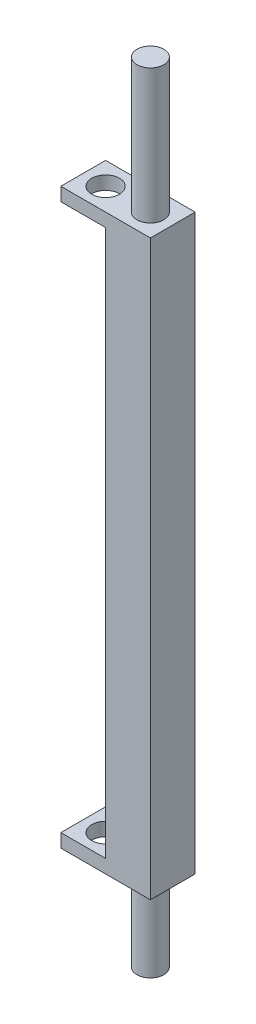
ISO-10303-21;
HEADER;
FILE_DESCRIPTION(('STEP AP214'),'2;1');
FILE_NAME('part.step','',(''),(''),'','','');
FILE_SCHEMA(('AUTOMOTIVE_DESIGN { 1 0 10303 214 1 1 1 1 }'));
ENDSEC;
DATA;
#1=APPLICATION_CONTEXT('core data for automotive mechanical design processes');
#2=APPLICATION_PROTOCOL_DEFINITION('international standard','automotive_design',2000,#1);
#3=PRODUCT_CONTEXT('',#1,'mechanical');
#4=PRODUCT('Part','Part','',(#3));
#5=PRODUCT_RELATED_PRODUCT_CATEGORY('part','',(#4));
#6=PRODUCT_DEFINITION_FORMATION('','',#4);
#7=PRODUCT_DEFINITION_CONTEXT('part definition',#1,'design');
#8=PRODUCT_DEFINITION('design','',#6,#7);
#9=PRODUCT_DEFINITION_SHAPE('','',#8);
#10=(LENGTH_UNIT() NAMED_UNIT(*) SI_UNIT(.MILLI.,.METRE.));
#11=(NAMED_UNIT(*) PLANE_ANGLE_UNIT() SI_UNIT($,.RADIAN.));
#12=(NAMED_UNIT(*) SI_UNIT($,.STERADIAN.) SOLID_ANGLE_UNIT());
#13=UNCERTAINTY_MEASURE_WITH_UNIT(LENGTH_MEASURE(1.E-05),#10,'distance_accuracy_value','');
#14=(GEOMETRIC_REPRESENTATION_CONTEXT(3) GLOBAL_UNCERTAINTY_ASSIGNED_CONTEXT((#13)) GLOBAL_UNIT_ASSIGNED_CONTEXT((#10,
#11,#12)) REPRESENTATION_CONTEXT('',''));
#15=CARTESIAN_POINT('',(0.,0.,0.));
#16=DIRECTION('',(0.,0.,1.));
#17=DIRECTION('',(1.,0.,0.));
#18=AXIS2_PLACEMENT_3D('',#15,#16,#17);
#19=CARTESIAN_POINT('',(0.,0.,0.));
#20=DIRECTION('',(0.,1.,0.));
#21=DIRECTION('',(0.,0.,1.));
#22=AXIS2_PLACEMENT_3D('',#19,#20,#21);
#23=PLANE('',#22);
#24=CARTESIAN_POINT('',(-2.5,0.,0.));
#25=DIRECTION('',(0.,-1.,0.));
#26=DIRECTION('',(0.,0.,-1.));
#27=AXIS2_PLACEMENT_3D('',#24,#25,#26);
#28=CIRCLE('',#27,1.55);
#29=CARTESIAN_POINT('',(-2.5,0.,-1.55));
#30=VERTEX_POINT('',#29);
#31=EDGE_CURVE('E157',#30,#30,#28,.T.);
#32=ORIENTED_EDGE('',*,*,#31,.F.);
#33=EDGE_LOOP('',(#32));
#34=FACE_BOUND('',#33,.T.);
#35=DIRECTION('',(0.,0.,-1.));
#36=VECTOR('',#35,1.);
#37=CARTESIAN_POINT('',(0.,0.,2.5));
#38=LINE('',#37,#36);
#39=CARTESIAN_POINT('',(0.,0.,2.5));
#40=VERTEX_POINT('',#39);
#41=CARTESIAN_POINT('',(0.,0.,-2.5));
#42=VERTEX_POINT('',#41);
#43=EDGE_CURVE('E50',#40,#42,#38,.T.);
#44=ORIENTED_EDGE('',*,*,#43,.F.);
#45=DIRECTION('',(-1.,0.,0.));
#46=VECTOR('',#45,1.);
#47=CARTESIAN_POINT('',(5.,0.,2.5));
#48=LINE('',#47,#46);
#49=CARTESIAN_POINT('',(-5.,0.,2.5));
#50=VERTEX_POINT('',#49);
#51=EDGE_CURVE('E72',#40,#50,#48,.T.);
#52=ORIENTED_EDGE('',*,*,#51,.T.);
#53=DIRECTION('',(0.,0.,-1.));
#54=VECTOR('',#53,1.);
#55=CARTESIAN_POINT('',(-5.,0.,2.5));
#56=LINE('',#55,#54);
#57=CARTESIAN_POINT('',(-5.,0.,-2.5));
#58=VERTEX_POINT('',#57);
#59=EDGE_CURVE('E171',#50,#58,#56,.T.);
#60=ORIENTED_EDGE('',*,*,#59,.T.);
#61=DIRECTION('',(-1.,0.,0.));
#62=VECTOR('',#61,1.);
#63=CARTESIAN_POINT('',(5.,0.,-2.5));
#64=LINE('',#63,#62);
#65=EDGE_CURVE('E161',#42,#58,#64,.T.);
#66=ORIENTED_EDGE('',*,*,#65,.F.);
#67=EDGE_LOOP('',(#44,#52,#60,#66));
#68=FACE_BOUND('',#67,.T.);
#69=ADVANCED_FACE('F35',(#34,#68),#23,.F.);
#70=CARTESIAN_POINT('',(5.,1.5,2.5));
#71=DIRECTION('',(-1.,0.,0.));
#72=DIRECTION('',(0.,0.,1.));
#73=AXIS2_PLACEMENT_3D('',#70,#71,#72);
#74=PLANE('',#73);
#75=DIRECTION('',(0.,-1.,0.));
#76=VECTOR('',#75,1.);
#77=CARTESIAN_POINT('',(5.,1.5,2.5));
#78=LINE('',#77,#76);
#79=CARTESIAN_POINT('',(5.,1.5,2.5));
#80=VERTEX_POINT('',#79);
#81=CARTESIAN_POINT('',(5.,-62.5,2.5));
#82=VERTEX_POINT('',#81);
#83=EDGE_CURVE('E59',#80,#82,#78,.T.);
#84=ORIENTED_EDGE('',*,*,#83,.T.);
#85=DIRECTION('',(0.,0.,1.));
#86=VECTOR('',#85,1.);
#87=CARTESIAN_POINT('',(5.,-62.5,2.5));
#88=LINE('',#87,#86);
#89=CARTESIAN_POINT('',(5.,-62.5,-2.5));
#90=VERTEX_POINT('',#89);
#91=EDGE_CURVE('E109',#90,#82,#88,.T.);
#92=ORIENTED_EDGE('',*,*,#91,.F.);
#93=DIRECTION('',(0.,-1.,0.));
#94=VECTOR('',#93,1.);
#95=CARTESIAN_POINT('',(5.,1.5,-2.5));
#96=LINE('',#95,#94);
#97=CARTESIAN_POINT('',(5.,1.5,-2.5));
#98=VERTEX_POINT('',#97);
#99=EDGE_CURVE('E43',#98,#90,#96,.T.);
#100=ORIENTED_EDGE('',*,*,#99,.F.);
#101=DIRECTION('',(0.,0.,-1.));
#102=VECTOR('',#101,1.);
#103=CARTESIAN_POINT('',(5.,1.5,2.5));
#104=LINE('',#103,#102);
#105=EDGE_CURVE('E110',#80,#98,#104,.T.);
#106=ORIENTED_EDGE('',*,*,#105,.F.);
#107=EDGE_LOOP('',(#84,#92,#100,#106));
#108=FACE_BOUND('',#107,.T.);
#109=ADVANCED_FACE('F37',(#108),#74,.F.);
#110=CARTESIAN_POINT('',(5.,1.5,-2.5));
#111=DIRECTION('',(0.,0.,1.));
#112=DIRECTION('',(1.,0.,0.));
#113=AXIS2_PLACEMENT_3D('',#110,#111,#112);
#114=PLANE('',#113);
#115=ORIENTED_EDGE('',*,*,#99,.T.);
#116=DIRECTION('',(1.,0.,0.));
#117=VECTOR('',#116,1.);
#118=CARTESIAN_POINT('',(5.,-62.5,-2.5));
#119=LINE('',#118,#117);
#120=CARTESIAN_POINT('',(-5.,-62.5,-2.5));
#121=VERTEX_POINT('',#120);
#122=EDGE_CURVE('E127',#121,#90,#119,.T.);
#123=ORIENTED_EDGE('',*,*,#122,.F.);
#124=DIRECTION('',(0.,1.,0.));
#125=VECTOR('',#124,1.);
#126=CARTESIAN_POINT('',(-5.,-62.5,-2.5));
#127=LINE('',#126,#125);
#128=CARTESIAN_POINT('',(-5.,-61.,-2.5));
#129=VERTEX_POINT('',#128);
#130=EDGE_CURVE('E139',#121,#129,#127,.T.);
#131=ORIENTED_EDGE('',*,*,#130,.T.);
#132=DIRECTION('',(1.,0.,0.));
#133=VECTOR('',#132,1.);
#134=CARTESIAN_POINT('',(5.,-61.,-2.5));
#135=LINE('',#134,#133);
#136=CARTESIAN_POINT('',(0.,-61.,-2.5));
#137=VERTEX_POINT('',#136);
#138=EDGE_CURVE('E128',#129,#137,#135,.T.);
#139=ORIENTED_EDGE('',*,*,#138,.T.);
#140=DIRECTION('',(0.,1.,0.));
#141=VECTOR('',#140,1.);
#142=CARTESIAN_POINT('',(0.,-61.,-2.5));
#143=LINE('',#142,#141);
#144=EDGE_CURVE('E150',#137,#42,#143,.T.);
#145=ORIENTED_EDGE('',*,*,#144,.T.);
#146=ORIENTED_EDGE('',*,*,#65,.T.);
#147=DIRECTION('',(0.,-1.,0.));
#148=VECTOR('',#147,1.);
#149=CARTESIAN_POINT('',(-5.,1.5,-2.5));
#150=LINE('',#149,#148);
#151=CARTESIAN_POINT('',(-5.,1.5,-2.5));
#152=VERTEX_POINT('',#151);
#153=EDGE_CURVE('E175',#152,#58,#150,.T.);
#154=ORIENTED_EDGE('',*,*,#153,.F.);
#155=DIRECTION('',(-1.,0.,0.));
#156=VECTOR('',#155,1.);
#157=CARTESIAN_POINT('',(5.,1.5,-2.5));
#158=LINE('',#157,#156);
#159=EDGE_CURVE('E80',#98,#152,#158,.T.);
#160=ORIENTED_EDGE('',*,*,#159,.F.);
#161=EDGE_LOOP('',(#115,#123,#131,#139,#145,#146,#154,#160));
#162=FACE_BOUND('',#161,.T.);
#163=ADVANCED_FACE('F177',(#162),#114,.F.);
#164=CARTESIAN_POINT('',(-5.,1.5,2.5));
#165=DIRECTION('',(-1.,0.,0.));
#166=DIRECTION('',(0.,0.,1.));
#167=AXIS2_PLACEMENT_3D('',#164,#165,#166);
#168=PLANE('',#167);
#169=ORIENTED_EDGE('',*,*,#59,.F.);
#170=DIRECTION('',(0.,-1.,0.));
#171=VECTOR('',#170,1.);
#172=CARTESIAN_POINT('',(-5.,1.5,2.5));
#173=LINE('',#172,#171);
#174=CARTESIAN_POINT('',(-5.,1.5,2.5));
#175=VERTEX_POINT('',#174);
#176=EDGE_CURVE('E112',#175,#50,#173,.T.);
#177=ORIENTED_EDGE('',*,*,#176,.F.);
#178=DIRECTION('',(0.,0.,-1.));
#179=VECTOR('',#178,1.);
#180=CARTESIAN_POINT('',(-5.,1.5,2.5));
#181=LINE('',#180,#179);
#182=EDGE_CURVE('E166',#175,#152,#181,.T.);
#183=ORIENTED_EDGE('',*,*,#182,.T.);
#184=ORIENTED_EDGE('',*,*,#153,.T.);
#185=EDGE_LOOP('',(#169,#177,#183,#184));
#186=FACE_BOUND('',#185,.T.);
#187=ADVANCED_FACE('F191',(#186),#168,.T.);
#188=CARTESIAN_POINT('',(5.,1.5,2.5));
#189=DIRECTION('',(0.,0.,1.));
#190=DIRECTION('',(1.,0.,0.));
#191=AXIS2_PLACEMENT_3D('',#188,#189,#190);
#192=PLANE('',#191);
#193=ORIENTED_EDGE('',*,*,#51,.F.);
#194=DIRECTION('',(0.,1.,0.));
#195=VECTOR('',#194,1.);
#196=CARTESIAN_POINT('',(0.,-61.,2.5));
#197=LINE('',#196,#195);
#198=CARTESIAN_POINT('',(0.,-61.,2.5));
#199=VERTEX_POINT('',#198);
#200=EDGE_CURVE('E154',#199,#40,#197,.T.);
#201=ORIENTED_EDGE('',*,*,#200,.F.);
#202=DIRECTION('',(-1.,0.,0.));
#203=VECTOR('',#202,1.);
#204=CARTESIAN_POINT('',(5.,-61.,2.5));
#205=LINE('',#204,#203);
#206=CARTESIAN_POINT('',(-5.,-61.,2.5));
#207=VERTEX_POINT('',#206);
#208=EDGE_CURVE('E140',#199,#207,#205,.T.);
#209=ORIENTED_EDGE('',*,*,#208,.T.);
#210=DIRECTION('',(0.,1.,0.));
#211=VECTOR('',#210,1.);
#212=CARTESIAN_POINT('',(-5.,-62.5,2.5));
#213=LINE('',#212,#211);
#214=CARTESIAN_POINT('',(-5.,-62.5,2.5));
#215=VERTEX_POINT('',#214);
#216=EDGE_CURVE('E119',#215,#207,#213,.T.);
#217=ORIENTED_EDGE('',*,*,#216,.F.);
#218=DIRECTION('',(-1.,0.,0.));
#219=VECTOR('',#218,1.);
#220=CARTESIAN_POINT('',(5.,-62.5,2.5));
#221=LINE('',#220,#219);
#222=EDGE_CURVE('E116',#82,#215,#221,.T.);
#223=ORIENTED_EDGE('',*,*,#222,.F.);
#224=ORIENTED_EDGE('',*,*,#83,.F.);
#225=DIRECTION('',(-1.,0.,0.));
#226=VECTOR('',#225,1.);
#227=CARTESIAN_POINT('',(5.,1.5,2.5));
#228=LINE('',#227,#226);
#229=EDGE_CURVE('E113',#80,#175,#228,.T.);
#230=ORIENTED_EDGE('',*,*,#229,.T.);
#231=ORIENTED_EDGE('',*,*,#176,.T.);
#232=EDGE_LOOP('',(#193,#201,#209,#217,#223,#224,#230,#231));
#233=FACE_BOUND('',#232,.T.);
#234=ADVANCED_FACE('F117',(#233),#192,.T.);
#235=CARTESIAN_POINT('',(0.,1.5,0.));
#236=DIRECTION('',(0.,1.,0.));
#237=DIRECTION('',(0.,0.,1.));
#238=AXIS2_PLACEMENT_3D('',#235,#236,#237);
#239=PLANE('',#238);
#240=CARTESIAN_POINT('',(2.5,1.5,0.));
#241=DIRECTION('',(0.,1.,0.));
#242=DIRECTION('',(0.,0.,1.));
#243=AXIS2_PLACEMENT_3D('',#240,#241,#242);
#244=CIRCLE('',#243,1.5);
#245=CARTESIAN_POINT('',(2.5,1.5,1.5));
#246=VERTEX_POINT('',#245);
#247=EDGE_CURVE('E330',#246,#246,#244,.T.);
#248=ORIENTED_EDGE('',*,*,#247,.F.);
#249=EDGE_LOOP('',(#248));
#250=FACE_BOUND('',#249,.T.);
#251=CARTESIAN_POINT('',(-2.5,1.5,0.));
#252=DIRECTION('',(0.,-1.,0.));
#253=DIRECTION('',(0.,0.,-1.));
#254=AXIS2_PLACEMENT_3D('',#251,#252,#253);
#255=CIRCLE('',#254,1.55);
#256=CARTESIAN_POINT('',(-2.5,1.5,-1.55));
#257=VERTEX_POINT('',#256);
#258=EDGE_CURVE('E158',#257,#257,#255,.T.);
#259=ORIENTED_EDGE('',*,*,#258,.T.);
#260=EDGE_LOOP('',(#259));
#261=FACE_BOUND('',#260,.T.);
#262=ORIENTED_EDGE('',*,*,#105,.T.);
#263=ORIENTED_EDGE('',*,*,#159,.T.);
#264=ORIENTED_EDGE('',*,*,#182,.F.);
#265=ORIENTED_EDGE('',*,*,#229,.F.);
#266=EDGE_LOOP('',(#262,#263,#264,#265));
#267=FACE_BOUND('',#266,.T.);
#268=ADVANCED_FACE('F193',(#250,#261,#267),#239,.T.);
#269=CARTESIAN_POINT('',(-2.5,1.5,0.));
#270=DIRECTION('',(0.,-1.,0.));
#271=DIRECTION('',(0.,0.,-1.));
#272=AXIS2_PLACEMENT_3D('',#269,#270,#271);
#273=CYLINDRICAL_SURFACE('',#272,1.55);
#274=ORIENTED_EDGE('',*,*,#258,.F.);
#275=EDGE_LOOP('',(#274));
#276=FACE_BOUND('',#275,.T.);
#277=ORIENTED_EDGE('',*,*,#31,.T.);
#278=EDGE_LOOP('',(#277));
#279=FACE_BOUND('',#278,.T.);
#280=ADVANCED_FACE('F195',(#276,#279),#273,.F.);
#281=CARTESIAN_POINT('',(0.,-61.,2.5));
#282=DIRECTION('',(1.,0.,0.));
#283=DIRECTION('',(0.,0.,-1.));
#284=AXIS2_PLACEMENT_3D('',#281,#282,#283);
#285=PLANE('',#284);
#286=ORIENTED_EDGE('',*,*,#43,.T.);
#287=ORIENTED_EDGE('',*,*,#144,.F.);
#288=DIRECTION('',(0.,0.,-1.));
#289=VECTOR('',#288,1.);
#290=CARTESIAN_POINT('',(0.,-61.,2.5));
#291=LINE('',#290,#289);
#292=EDGE_CURVE('E147',#199,#137,#291,.T.);
#293=ORIENTED_EDGE('',*,*,#292,.F.);
#294=ORIENTED_EDGE('',*,*,#200,.T.);
#295=EDGE_LOOP('',(#286,#287,#293,#294));
#296=FACE_BOUND('',#295,.T.);
#297=ADVANCED_FACE('F187',(#296),#285,.F.);
#298=CARTESIAN_POINT('',(-5.,-62.5,2.5));
#299=DIRECTION('',(1.,0.,0.));
#300=DIRECTION('',(0.,0.,-1.));
#301=AXIS2_PLACEMENT_3D('',#298,#299,#300);
#302=PLANE('',#301);
#303=DIRECTION('',(0.,0.,-1.));
#304=VECTOR('',#303,1.);
#305=CARTESIAN_POINT('',(-5.,-61.,2.5));
#306=LINE('',#305,#304);
#307=EDGE_CURVE('E131',#207,#129,#306,.T.);
#308=ORIENTED_EDGE('',*,*,#307,.T.);
#309=ORIENTED_EDGE('',*,*,#130,.F.);
#310=DIRECTION('',(0.,0.,-1.));
#311=VECTOR('',#310,1.);
#312=CARTESIAN_POINT('',(-5.,-62.5,2.5));
#313=LINE('',#312,#311);
#314=EDGE_CURVE('E122',#215,#121,#313,.T.);
#315=ORIENTED_EDGE('',*,*,#314,.F.);
#316=ORIENTED_EDGE('',*,*,#216,.T.);
#317=EDGE_LOOP('',(#308,#309,#315,#316));
#318=FACE_BOUND('',#317,.T.);
#319=ADVANCED_FACE('F241',(#318),#302,.F.);
#320=CARTESIAN_POINT('',(0.,-62.5,0.));
#321=DIRECTION('',(0.,1.,0.));
#322=DIRECTION('',(0.,0.,1.));
#323=AXIS2_PLACEMENT_3D('',#320,#321,#322);
#324=PLANE('',#323);
#325=CARTESIAN_POINT('',(2.5,-62.5,0.));
#326=DIRECTION('',(0.,1.,0.));
#327=DIRECTION('',(0.,0.,1.));
#328=AXIS2_PLACEMENT_3D('',#325,#326,#327);
#329=CIRCLE('',#328,1.5);
#330=CARTESIAN_POINT('',(2.5,-62.5,1.5));
#331=VERTEX_POINT('',#330);
#332=EDGE_CURVE('E11',#331,#331,#329,.F.);
#333=ORIENTED_EDGE('',*,*,#332,.F.);
#334=EDGE_LOOP('',(#333));
#335=FACE_BOUND('',#334,.T.);
#336=CARTESIAN_POINT('',(-2.5,-62.5,0.));
#337=DIRECTION('',(0.,-1.,0.));
#338=DIRECTION('',(0.,0.,-1.));
#339=AXIS2_PLACEMENT_3D('',#336,#337,#338);
#340=CIRCLE('',#339,1.55);
#341=CARTESIAN_POINT('',(-2.5,-62.5,-1.55));
#342=VERTEX_POINT('',#341);
#343=EDGE_CURVE('E134',#342,#342,#340,.T.);
#344=ORIENTED_EDGE('',*,*,#343,.F.);
#345=EDGE_LOOP('',(#344));
#346=FACE_BOUND('',#345,.T.);
#347=ORIENTED_EDGE('',*,*,#91,.T.);
#348=ORIENTED_EDGE('',*,*,#222,.T.);
#349=ORIENTED_EDGE('',*,*,#314,.T.);
#350=ORIENTED_EDGE('',*,*,#122,.T.);
#351=EDGE_LOOP('',(#347,#348,#349,#350));
#352=FACE_BOUND('',#351,.T.);
#353=ADVANCED_FACE('F125',(#335,#346,#352),#324,.F.);
#354=CARTESIAN_POINT('',(0.,-61.,0.));
#355=DIRECTION('',(0.,1.,0.));
#356=DIRECTION('',(0.,0.,1.));
#357=AXIS2_PLACEMENT_3D('',#354,#355,#356);
#358=PLANE('',#357);
#359=CARTESIAN_POINT('',(-2.5,-61.,0.));
#360=DIRECTION('',(0.,-1.,0.));
#361=DIRECTION('',(0.,0.,-1.));
#362=AXIS2_PLACEMENT_3D('',#359,#360,#361);
#363=CIRCLE('',#362,1.55);
#364=CARTESIAN_POINT('',(-2.5,-61.,-1.55));
#365=VERTEX_POINT('',#364);
#366=EDGE_CURVE('E142',#365,#365,#363,.T.);
#367=ORIENTED_EDGE('',*,*,#366,.T.);
#368=EDGE_LOOP('',(#367));
#369=FACE_BOUND('',#368,.T.);
#370=ORIENTED_EDGE('',*,*,#208,.F.);
#371=ORIENTED_EDGE('',*,*,#292,.T.);
#372=ORIENTED_EDGE('',*,*,#138,.F.);
#373=ORIENTED_EDGE('',*,*,#307,.F.);
#374=EDGE_LOOP('',(#370,#371,#372,#373));
#375=FACE_BOUND('',#374,.T.);
#376=ADVANCED_FACE('F184',(#369,#375),#358,.T.);
#377=CARTESIAN_POINT('',(-2.5,-61.,0.));
#378=DIRECTION('',(0.,-1.,0.));
#379=DIRECTION('',(0.,0.,-1.));
#380=AXIS2_PLACEMENT_3D('',#377,#378,#379);
#381=CYLINDRICAL_SURFACE('',#380,1.55);
#382=ORIENTED_EDGE('',*,*,#366,.F.);
#383=EDGE_LOOP('',(#382));
#384=FACE_BOUND('',#383,.T.);
#385=ORIENTED_EDGE('',*,*,#343,.T.);
#386=EDGE_LOOP('',(#385));
#387=FACE_BOUND('',#386,.T.);
#388=ADVANCED_FACE('F260',(#384,#387),#381,.F.);
#389=CARTESIAN_POINT('',(2.5,16.5,0.));
#390=DIRECTION('',(0.,-1.,0.));
#391=DIRECTION('',(0.,0.,-1.));
#392=AXIS2_PLACEMENT_3D('',#389,#390,#391);
#393=CYLINDRICAL_SURFACE('',#392,1.5);
#394=CARTESIAN_POINT('',(2.5,16.5,0.));
#395=DIRECTION('',(0.,1.,0.));
#396=DIRECTION('',(0.,0.,1.));
#397=AXIS2_PLACEMENT_3D('',#394,#395,#396);
#398=CIRCLE('',#397,1.5);
#399=CARTESIAN_POINT('',(2.5,16.5,1.5));
#400=VERTEX_POINT('',#399);
#401=EDGE_CURVE('E333',#400,#400,#398,.T.);
#402=ORIENTED_EDGE('',*,*,#401,.F.);
#403=EDGE_LOOP('',(#402));
#404=FACE_BOUND('',#403,.T.);
#405=ORIENTED_EDGE('',*,*,#247,.T.);
#406=EDGE_LOOP('',(#405));
#407=FACE_BOUND('',#406,.T.);
#408=ADVANCED_FACE('F269',(#404,#407),#393,.T.);
#409=CARTESIAN_POINT('',(2.5,16.5,0.));
#410=DIRECTION('',(0.,1.,0.));
#411=DIRECTION('',(0.,0.,1.));
#412=AXIS2_PLACEMENT_3D('',#409,#410,#411);
#413=PLANE('',#412);
#414=ORIENTED_EDGE('',*,*,#401,.T.);
#415=EDGE_LOOP('',(#414));
#416=FACE_BOUND('',#415,.T.);
#417=ADVANCED_FACE('F286',(#416),#413,.T.);
#418=CARTESIAN_POINT('',(2.5,-71.5,0.));
#419=DIRECTION('',(0.,1.,0.));
#420=DIRECTION('',(0.,0.,1.));
#421=AXIS2_PLACEMENT_3D('',#418,#419,#420);
#422=CYLINDRICAL_SURFACE('',#421,1.5);
#423=CARTESIAN_POINT('',(2.5,-71.5,0.));
#424=DIRECTION('',(0.,-1.,0.));
#425=DIRECTION('',(0.,0.,-1.));
#426=AXIS2_PLACEMENT_3D('',#423,#424,#425);
#427=CIRCLE('',#426,1.5);
#428=CARTESIAN_POINT('',(2.5,-71.5,-1.5));
#429=VERTEX_POINT('',#428);
#430=EDGE_CURVE('E329',#429,#429,#427,.T.);
#431=ORIENTED_EDGE('',*,*,#430,.F.);
#432=EDGE_LOOP('',(#431));
#433=FACE_BOUND('',#432,.T.);
#434=ORIENTED_EDGE('',*,*,#332,.T.);
#435=EDGE_LOOP('',(#434));
#436=FACE_BOUND('',#435,.T.);
#437=ADVANCED_FACE('F296',(#433,#436),#422,.T.);
#438=CARTESIAN_POINT('',(2.5,-71.5,0.));
#439=DIRECTION('',(0.,-1.,0.));
#440=DIRECTION('',(0.,0.,-1.));
#441=AXIS2_PLACEMENT_3D('',#438,#439,#440);
#442=PLANE('',#441);
#443=ORIENTED_EDGE('',*,*,#430,.T.);
#444=EDGE_LOOP('',(#443));
#445=FACE_BOUND('',#444,.T.);
#446=ADVANCED_FACE('F313',(#445),#442,.T.);
#447=CLOSED_SHELL('',(#69,#109,#163,#187,#234,#268,#280,#297,#319,#353,#376,#388,#408,#417,#437,#446));
#448=MANIFOLD_SOLID_BREP('B2',#447);
#449=ADVANCED_BREP_SHAPE_REPRESENTATION('',(#18,#448),#14);
#450=SHAPE_DEFINITION_REPRESENTATION(#9,#449);
ENDSEC;
END-ISO-10303-21;
